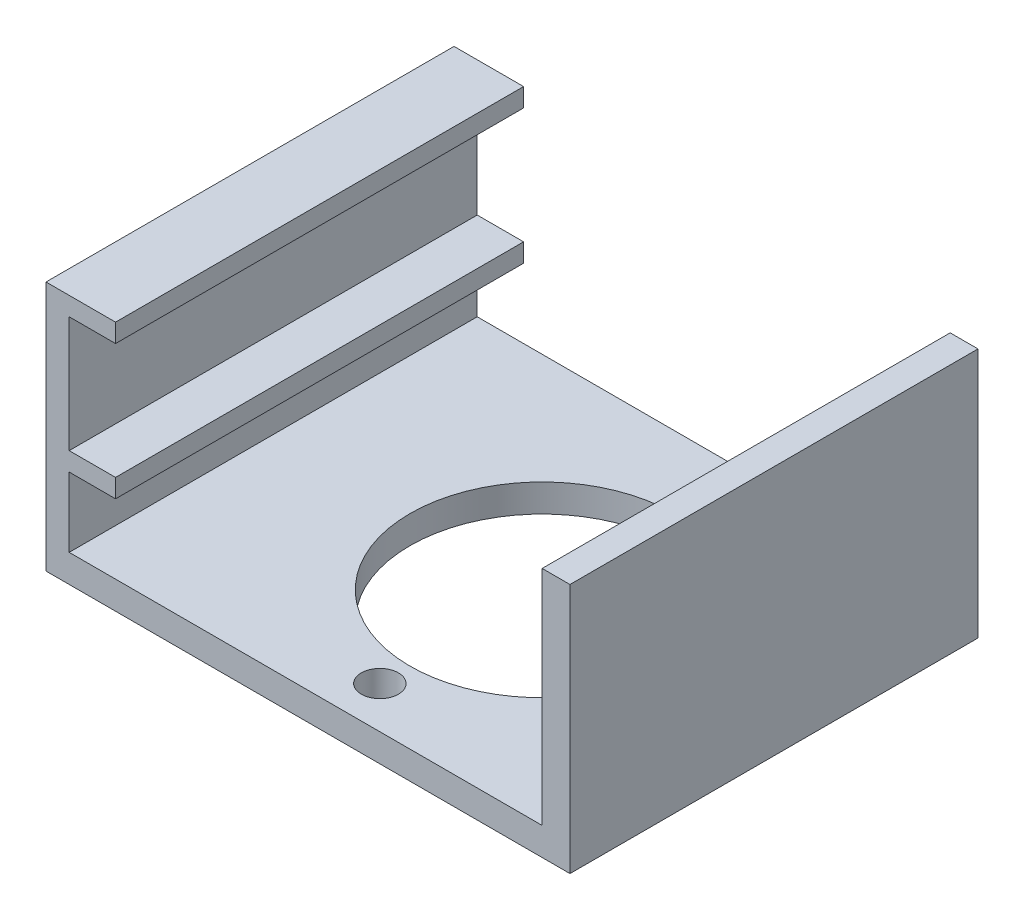
ISO-10303-21;
HEADER;
FILE_DESCRIPTION(('STEP AP214'),'2;1');
FILE_NAME('part.step','',(''),(''),'','','');
FILE_SCHEMA(('AUTOMOTIVE_DESIGN { 1 0 10303 214 1 1 1 1 }'));
ENDSEC;
DATA;
#1=APPLICATION_CONTEXT('core data for automotive mechanical design processes');
#2=APPLICATION_PROTOCOL_DEFINITION('international standard','automotive_design',2000,#1);
#3=PRODUCT_CONTEXT('',#1,'mechanical');
#4=PRODUCT('Part','Part','',(#3));
#5=PRODUCT_RELATED_PRODUCT_CATEGORY('part','',(#4));
#6=PRODUCT_DEFINITION_FORMATION('','',#4);
#7=PRODUCT_DEFINITION_CONTEXT('part definition',#1,'design');
#8=PRODUCT_DEFINITION('design','',#6,#7);
#9=PRODUCT_DEFINITION_SHAPE('','',#8);
#10=(LENGTH_UNIT() NAMED_UNIT(*) SI_UNIT(.MILLI.,.METRE.));
#11=(NAMED_UNIT(*) PLANE_ANGLE_UNIT() SI_UNIT($,.RADIAN.));
#12=(NAMED_UNIT(*) SI_UNIT($,.STERADIAN.) SOLID_ANGLE_UNIT());
#13=UNCERTAINTY_MEASURE_WITH_UNIT(LENGTH_MEASURE(1.E-05),#10,'distance_accuracy_value','');
#14=(GEOMETRIC_REPRESENTATION_CONTEXT(3) GLOBAL_UNCERTAINTY_ASSIGNED_CONTEXT((#13)) GLOBAL_UNIT_ASSIGNED_CONTEXT((#10,
#11,#12)) REPRESENTATION_CONTEXT('',''));
#15=CARTESIAN_POINT('',(0.,0.,0.));
#16=DIRECTION('',(0.,0.,1.));
#17=DIRECTION('',(1.,0.,0.));
#18=AXIS2_PLACEMENT_3D('',#15,#16,#17);
#19=CARTESIAN_POINT('',(0.,3.,0.));
#20=DIRECTION('',(0.,1.,0.));
#21=DIRECTION('',(0.,0.,1.));
#22=AXIS2_PLACEMENT_3D('',#19,#20,#21);
#23=PLANE('',#22);
#24=DIRECTION('',(-1.,0.,0.));
#25=VECTOR('',#24,1.);
#26=CARTESIAN_POINT('',(0.,3.,-4.18482749388201));
#27=LINE('',#26,#25);
#28=CARTESIAN_POINT('',(19.5682815384209,3.,-4.18482749388201));
#29=VERTEX_POINT('',#28);
#30=CARTESIAN_POINT('',(17.2661053468397,3.,-4.18482749388201));
#31=VERTEX_POINT('',#30);
#32=EDGE_CURVE('E261',#29,#31,#27,.T.);
#33=ORIENTED_EDGE('',*,*,#32,.F.);
#34=CARTESIAN_POINT('',(6.92093739266903,3.,5.61517250611799));
#35=DIRECTION('',(0.,1.,0.));
#36=DIRECTION('',(0.,0.,1.));
#37=AXIS2_PLACEMENT_3D('',#34,#35,#36);
#38=CIRCLE('',#37,15.9998535599887);
#39=CARTESIAN_POINT('',(21.1066807267733,3.,-1.78482749388201));
#40=VERTEX_POINT('',#39);
#41=EDGE_CURVE('E258',#40,#29,#38,.T.);
#42=ORIENTED_EDGE('',*,*,#41,.F.);
#43=DIRECTION('',(1.,0.,0.));
#44=VECTOR('',#43,1.);
#45=CARTESIAN_POINT('',(0.,3.,-1.78482749388201));
#46=LINE('',#45,#44);
#47=CARTESIAN_POINT('',(24.920937392669,3.,-1.78482749388201));
#48=VERTEX_POINT('',#47);
#49=EDGE_CURVE('E366',#40,#48,#46,.T.);
#50=ORIENTED_EDGE('',*,*,#49,.T.);
#51=DIRECTION('',(0.,0.,1.));
#52=VECTOR('',#51,1.);
#53=CARTESIAN_POINT('',(24.920937392669,3.,-16.384827493882));
#54=LINE('',#53,#52);
#55=CARTESIAN_POINT('',(24.920937392669,3.,13.015172506118));
#56=VERTEX_POINT('',#55);
#57=EDGE_CURVE('E293',#48,#56,#54,.T.);
#58=ORIENTED_EDGE('',*,*,#57,.T.);
#59=DIRECTION('',(1.,0.,0.));
#60=VECTOR('',#59,1.);
#61=CARTESIAN_POINT('',(0.,3.,13.015172506118));
#62=LINE('',#61,#60);
#63=CARTESIAN_POINT('',(21.1066807267733,3.,13.015172506118));
#64=VERTEX_POINT('',#63);
#65=EDGE_CURVE('E368',#64,#56,#62,.T.);
#66=ORIENTED_EDGE('',*,*,#65,.F.);
#67=CARTESIAN_POINT('',(6.92093739266903,3.,5.61517250611799));
#68=DIRECTION('',(0.,1.,0.));
#69=DIRECTION('',(0.,0.,1.));
#70=AXIS2_PLACEMENT_3D('',#67,#68,#69);
#71=CIRCLE('',#70,15.9998535599887);
#72=CARTESIAN_POINT('',(19.5682815384209,3.,15.415172506118));
#73=VERTEX_POINT('',#72);
#74=EDGE_CURVE('E271',#73,#64,#71,.T.);
#75=ORIENTED_EDGE('',*,*,#74,.F.);
#76=DIRECTION('',(-1.,0.,0.));
#77=VECTOR('',#76,1.);
#78=CARTESIAN_POINT('',(0.,3.,15.415172506118));
#79=LINE('',#78,#77);
#80=CARTESIAN_POINT('',(17.2661053468397,3.,15.415172506118));
#81=VERTEX_POINT('',#80);
#82=EDGE_CURVE('E257',#73,#81,#79,.T.);
#83=ORIENTED_EDGE('',*,*,#82,.T.);
#84=CARTESIAN_POINT('',(6.92093739266903,3.,5.61517250611799));
#85=DIRECTION('',(0.,1.,0.));
#86=DIRECTION('',(0.,0.,1.));
#87=AXIS2_PLACEMENT_3D('',#84,#85,#86);
#88=CIRCLE('',#87,14.25);
#89=EDGE_CURVE('E290',#31,#81,#88,.T.);
#90=ORIENTED_EDGE('',*,*,#89,.F.);
#91=EDGE_LOOP('',(#33,#42,#50,#58,#66,#75,#83,#90));
#92=FACE_BOUND('',#91,.T.);
#93=DIRECTION('',(-1.,0.,0.));
#94=VECTOR('',#93,1.);
#95=CARTESIAN_POINT('',(-19.079062607331,3.,27.615172506118));
#96=LINE('',#95,#94);
#97=CARTESIAN_POINT('',(28.920937392669,3.,27.615172506118));
#98=VERTEX_POINT('',#97);
#99=CARTESIAN_POINT('',(-22.079062607331,3.,27.615172506118));
#100=VERTEX_POINT('',#99);
#101=EDGE_CURVE('E346',#98,#100,#96,.T.);
#102=ORIENTED_EDGE('',*,*,#101,.F.);
#103=DIRECTION('',(0.,0.,1.));
#104=VECTOR('',#103,1.);
#105=CARTESIAN_POINT('',(28.920937392669,3.,-16.384827493882));
#106=LINE('',#105,#104);
#107=CARTESIAN_POINT('',(28.920937392669,3.,-16.384827493882));
#108=VERTEX_POINT('',#107);
#109=EDGE_CURVE('E297',#108,#98,#106,.T.);
#110=ORIENTED_EDGE('',*,*,#109,.F.);
#111=DIRECTION('',(1.,0.,0.));
#112=VECTOR('',#111,1.);
#113=CARTESIAN_POINT('',(24.920937392669,3.,-16.384827493882));
#114=LINE('',#113,#112);
#115=CARTESIAN_POINT('',(-22.079062607331,3.,-16.384827493882));
#116=VERTEX_POINT('',#115);
#117=EDGE_CURVE('E336',#116,#108,#114,.T.);
#118=ORIENTED_EDGE('',*,*,#117,.F.);
#119=DIRECTION('',(0.,0.,-1.));
#120=VECTOR('',#119,1.);
#121=CARTESIAN_POINT('',(-22.079062607331,3.,-16.384827493882));
#122=LINE('',#121,#120);
#123=EDGE_CURVE('E228',#100,#116,#122,.T.);
#124=ORIENTED_EDGE('',*,*,#123,.F.);
#125=EDGE_LOOP('',(#102,#110,#118,#124));
#126=FACE_BOUND('',#125,.T.);
#127=CARTESIAN_POINT('',(6.92093739266903,3.,23.115172506118));
#128=DIRECTION('',(0.,1.,0.));
#129=DIRECTION('',(0.,0.,1.));
#130=AXIS2_PLACEMENT_3D('',#127,#128,#129);
#131=CIRCLE('',#130,2.);
#132=CARTESIAN_POINT('',(6.92093739266903,3.,25.115172506118));
#133=VERTEX_POINT('',#132);
#134=EDGE_CURVE('E370',#133,#133,#131,.T.);
#135=ORIENTED_EDGE('',*,*,#134,.F.);
#136=EDGE_LOOP('',(#135));
#137=FACE_BOUND('',#136,.T.);
#138=CARTESIAN_POINT('',(6.92093739266903,3.,-11.884827493882));
#139=DIRECTION('',(0.,1.,0.));
#140=DIRECTION('',(0.,0.,1.));
#141=AXIS2_PLACEMENT_3D('',#138,#139,#140);
#142=CIRCLE('',#141,2.);
#143=CARTESIAN_POINT('',(6.92093739266903,3.,-9.88482749388201));
#144=VERTEX_POINT('',#143);
#145=EDGE_CURVE('E355',#144,#144,#142,.T.);
#146=ORIENTED_EDGE('',*,*,#145,.F.);
#147=EDGE_LOOP('',(#146));
#148=FACE_BOUND('',#147,.T.);
#149=ADVANCED_FACE('F36',(#92,#126,#137,#148),#23,.T.);
#150=CARTESIAN_POINT('',(0.,0.,0.));
#151=DIRECTION('',(0.,1.,0.));
#152=DIRECTION('',(0.,0.,1.));
#153=AXIS2_PLACEMENT_3D('',#150,#151,#152);
#154=PLANE('',#153);
#155=DIRECTION('',(1.,0.,0.));
#156=VECTOR('',#155,1.);
#157=CARTESIAN_POINT('',(26.920937392669,0.,27.615172506118));
#158=LINE('',#157,#156);
#159=CARTESIAN_POINT('',(-24.579062607331,0.,27.615172506118));
#160=VERTEX_POINT('',#159);
#161=CARTESIAN_POINT('',(31.920937392669,0.,27.615172506118));
#162=VERTEX_POINT('',#161);
#163=EDGE_CURVE('E205',#160,#162,#158,.T.);
#164=ORIENTED_EDGE('',*,*,#163,.F.);
#165=DIRECTION('',(0.,0.,1.));
#166=VECTOR('',#165,1.);
#167=CARTESIAN_POINT('',(-24.579062607331,0.,-16.384827493882));
#168=LINE('',#167,#166);
#169=CARTESIAN_POINT('',(-24.579062607331,0.,-16.384827493882));
#170=VERTEX_POINT('',#169);
#171=EDGE_CURVE('E203',#170,#160,#168,.T.);
#172=ORIENTED_EDGE('',*,*,#171,.F.);
#173=DIRECTION('',(-1.,0.,0.));
#174=VECTOR('',#173,1.);
#175=CARTESIAN_POINT('',(-23.079062607331,0.,-16.384827493882));
#176=LINE('',#175,#174);
#177=CARTESIAN_POINT('',(31.920937392669,0.,-16.384827493882));
#178=VERTEX_POINT('',#177);
#179=EDGE_CURVE('E187',#178,#170,#176,.T.);
#180=ORIENTED_EDGE('',*,*,#179,.F.);
#181=DIRECTION('',(0.,0.,-1.));
#182=VECTOR('',#181,1.);
#183=CARTESIAN_POINT('',(31.920937392669,0.,27.615172506118));
#184=LINE('',#183,#182);
#185=EDGE_CURVE('E309',#162,#178,#184,.T.);
#186=ORIENTED_EDGE('',*,*,#185,.F.);
#187=EDGE_LOOP('',(#164,#172,#180,#186));
#188=FACE_BOUND('',#187,.T.);
#189=CARTESIAN_POINT('',(6.92093739266903,0.,-11.884827493882));
#190=DIRECTION('',(0.,-1.,0.));
#191=DIRECTION('',(0.,0.,-1.));
#192=AXIS2_PLACEMENT_3D('',#189,#190,#191);
#193=CIRCLE('',#192,2.);
#194=CARTESIAN_POINT('',(6.92093739266903,0.,-13.884827493882));
#195=VERTEX_POINT('',#194);
#196=EDGE_CURVE('E351',#195,#195,#193,.T.);
#197=ORIENTED_EDGE('',*,*,#196,.F.);
#198=EDGE_LOOP('',(#197));
#199=FACE_BOUND('',#198,.T.);
#200=CARTESIAN_POINT('',(6.92093739266903,0.,23.115172506118));
#201=DIRECTION('',(0.,-1.,0.));
#202=DIRECTION('',(0.,0.,-1.));
#203=AXIS2_PLACEMENT_3D('',#200,#201,#202);
#204=CIRCLE('',#203,2.);
#205=CARTESIAN_POINT('',(6.92093739266903,0.,21.115172506118));
#206=VERTEX_POINT('',#205);
#207=EDGE_CURVE('E352',#206,#206,#204,.T.);
#208=ORIENTED_EDGE('',*,*,#207,.F.);
#209=EDGE_LOOP('',(#208));
#210=FACE_BOUND('',#209,.T.);
#211=CARTESIAN_POINT('',(6.92093739266903,0.,5.61517250611799));
#212=DIRECTION('',(0.,1.,0.));
#213=DIRECTION('',(0.,0.,1.));
#214=AXIS2_PLACEMENT_3D('',#211,#212,#213);
#215=CIRCLE('',#214,15.9998535599887);
#216=CARTESIAN_POINT('',(21.1066807267733,0.,-1.78482749388201));
#217=VERTEX_POINT('',#216);
#218=CARTESIAN_POINT('',(19.5682815384209,0.,-4.18482749388201));
#219=VERTEX_POINT('',#218);
#220=EDGE_CURVE('E281',#217,#219,#215,.T.);
#221=ORIENTED_EDGE('',*,*,#220,.T.);
#222=DIRECTION('',(-1.,0.,0.));
#223=VECTOR('',#222,1.);
#224=CARTESIAN_POINT('',(0.,0.,-4.18482749388201));
#225=LINE('',#224,#223);
#226=CARTESIAN_POINT('',(17.2661053468397,0.,-4.18482749388201));
#227=VERTEX_POINT('',#226);
#228=EDGE_CURVE('E278',#219,#227,#225,.T.);
#229=ORIENTED_EDGE('',*,*,#228,.T.);
#230=CARTESIAN_POINT('',(6.92093739266903,0.,5.61517250611799));
#231=DIRECTION('',(0.,-1.,0.));
#232=DIRECTION('',(0.,0.,-1.));
#233=AXIS2_PLACEMENT_3D('',#230,#231,#232);
#234=CIRCLE('',#233,14.25);
#235=CARTESIAN_POINT('',(17.2661053468397,0.,15.415172506118));
#236=VERTEX_POINT('',#235);
#237=EDGE_CURVE('E287',#236,#227,#234,.T.);
#238=ORIENTED_EDGE('',*,*,#237,.F.);
#239=DIRECTION('',(-1.,0.,0.));
#240=VECTOR('',#239,1.);
#241=CARTESIAN_POINT('',(0.,0.,15.415172506118));
#242=LINE('',#241,#240);
#243=CARTESIAN_POINT('',(19.5682815384209,0.,15.415172506118));
#244=VERTEX_POINT('',#243);
#245=EDGE_CURVE('E267',#244,#236,#242,.T.);
#246=ORIENTED_EDGE('',*,*,#245,.F.);
#247=CARTESIAN_POINT('',(6.92093739266903,0.,5.61517250611799));
#248=DIRECTION('',(0.,1.,0.));
#249=DIRECTION('',(0.,0.,1.));
#250=AXIS2_PLACEMENT_3D('',#247,#248,#249);
#251=CIRCLE('',#250,15.9998535599887);
#252=CARTESIAN_POINT('',(21.1066807267733,0.,13.015172506118));
#253=VERTEX_POINT('',#252);
#254=EDGE_CURVE('E284',#244,#253,#251,.T.);
#255=ORIENTED_EDGE('',*,*,#254,.T.);
#256=DIRECTION('',(-1.,0.,0.));
#257=VECTOR('',#256,1.);
#258=CARTESIAN_POINT('',(0.,0.,13.015172506118));
#259=LINE('',#258,#257);
#260=CARTESIAN_POINT('',(24.920937392669,0.,13.015172506118));
#261=VERTEX_POINT('',#260);
#262=EDGE_CURVE('E357',#261,#253,#259,.T.);
#263=ORIENTED_EDGE('',*,*,#262,.F.);
#264=DIRECTION('',(0.,0.,1.));
#265=VECTOR('',#264,1.);
#266=CARTESIAN_POINT('',(24.920937392669,0.,13.015172506118));
#267=LINE('',#266,#265);
#268=CARTESIAN_POINT('',(24.920937392669,0.,-1.78482749388201));
#269=VERTEX_POINT('',#268);
#270=EDGE_CURVE('E321',#269,#261,#267,.T.);
#271=ORIENTED_EDGE('',*,*,#270,.F.);
#272=DIRECTION('',(-1.,0.,0.));
#273=VECTOR('',#272,1.);
#274=CARTESIAN_POINT('',(0.,0.,-1.78482749388201));
#275=LINE('',#274,#273);
#276=EDGE_CURVE('E356',#269,#217,#275,.T.);
#277=ORIENTED_EDGE('',*,*,#276,.T.);
#278=EDGE_LOOP('',(#221,#229,#238,#246,#255,#263,#271,#277));
#279=FACE_BOUND('',#278,.T.);
#280=ADVANCED_FACE('F38',(#188,#199,#210,#279),#154,.F.);
#281=CARTESIAN_POINT('',(6.92093739266903,4.,5.61517250611799));
#282=DIRECTION('',(0.,-1.,0.));
#283=DIRECTION('',(0.,0.,-1.));
#284=AXIS2_PLACEMENT_3D('',#281,#282,#283);
#285=CYLINDRICAL_SURFACE('',#284,14.25);
#286=ORIENTED_EDGE('',*,*,#237,.T.);
#287=DIRECTION('',(0.,-1.,0.));
#288=VECTOR('',#287,1.);
#289=CARTESIAN_POINT('',(17.2661053468397,4.,-4.18482749388201));
#290=LINE('',#289,#288);
#291=EDGE_CURVE('E12',#227,#31,#290,.F.);
#292=ORIENTED_EDGE('',*,*,#291,.T.);
#293=ORIENTED_EDGE('',*,*,#89,.T.);
#294=DIRECTION('',(0.,-1.,0.));
#295=VECTOR('',#294,1.);
#296=CARTESIAN_POINT('',(17.2661053468397,4.,15.415172506118));
#297=LINE('',#296,#295);
#298=EDGE_CURVE('E46',#236,#81,#297,.F.);
#299=ORIENTED_EDGE('',*,*,#298,.F.);
#300=EDGE_LOOP('',(#286,#292,#293,#299));
#301=FACE_BOUND('',#300,.T.);
#302=ADVANCED_FACE('F387',(#301),#285,.F.);
#303=CARTESIAN_POINT('',(0.,27.,0.));
#304=DIRECTION('',(0.,1.,0.));
#305=DIRECTION('',(0.,0.,1.));
#306=AXIS2_PLACEMENT_3D('',#303,#304,#305);
#307=PLANE('',#306);
#308=DIRECTION('',(0.,0.,1.));
#309=VECTOR('',#308,1.);
#310=CARTESIAN_POINT('',(-17.079062607331,27.,-16.384827493882));
#311=LINE('',#310,#309);
#312=CARTESIAN_POINT('',(-17.079062607331,27.,-16.384827493882));
#313=VERTEX_POINT('',#312);
#314=CARTESIAN_POINT('',(-17.079062607331,27.,27.615172506118));
#315=VERTEX_POINT('',#314);
#316=EDGE_CURVE('E240',#313,#315,#311,.T.);
#317=ORIENTED_EDGE('',*,*,#316,.F.);
#318=DIRECTION('',(1.,0.,0.));
#319=VECTOR('',#318,1.);
#320=CARTESIAN_POINT('',(-19.079062607331,27.,-16.384827493882));
#321=LINE('',#320,#319);
#322=CARTESIAN_POINT('',(-24.579062607331,27.,-16.384827493882));
#323=VERTEX_POINT('',#322);
#324=EDGE_CURVE('E199',#323,#313,#321,.T.);
#325=ORIENTED_EDGE('',*,*,#324,.F.);
#326=DIRECTION('',(0.,0.,-1.));
#327=VECTOR('',#326,1.);
#328=CARTESIAN_POINT('',(-24.579062607331,27.,-16.384827493882));
#329=LINE('',#328,#327);
#330=CARTESIAN_POINT('',(-24.579062607331,27.,27.615172506118));
#331=VERTEX_POINT('',#330);
#332=EDGE_CURVE('E214',#331,#323,#329,.T.);
#333=ORIENTED_EDGE('',*,*,#332,.F.);
#334=DIRECTION('',(-1.,0.,0.));
#335=VECTOR('',#334,1.);
#336=CARTESIAN_POINT('',(-23.079062607331,27.,27.615172506118));
#337=LINE('',#336,#335);
#338=EDGE_CURVE('E340',#315,#331,#337,.T.);
#339=ORIENTED_EDGE('',*,*,#338,.F.);
#340=EDGE_LOOP('',(#317,#325,#333,#339));
#341=FACE_BOUND('',#340,.T.);
#342=ADVANCED_FACE('F426',(#341),#307,.T.);
#343=CARTESIAN_POINT('',(-21.079062607331,25.,25.615172506118));
#344=DIRECTION('',(0.,1.,0.));
#345=DIRECTION('',(0.,0.,1.));
#346=AXIS2_PLACEMENT_3D('',#343,#344,#345);
#347=PLANE('',#346);
#348=DIRECTION('',(-1.,0.,0.));
#349=VECTOR('',#348,1.);
#350=CARTESIAN_POINT('',(-21.079062607331,25.,-16.384827493882));
#351=LINE('',#350,#349);
#352=CARTESIAN_POINT('',(-17.079062607331,25.,-16.384827493882));
#353=VERTEX_POINT('',#352);
#354=CARTESIAN_POINT('',(-22.079062607331,25.,-16.384827493882));
#355=VERTEX_POINT('',#354);
#356=EDGE_CURVE('E334',#353,#355,#351,.T.);
#357=ORIENTED_EDGE('',*,*,#356,.F.);
#358=DIRECTION('',(0.,0.,-1.));
#359=VECTOR('',#358,1.);
#360=CARTESIAN_POINT('',(-17.079062607331,25.,-16.384827493882));
#361=LINE('',#360,#359);
#362=CARTESIAN_POINT('',(-17.079062607331,25.,27.615172506118));
#363=VERTEX_POINT('',#362);
#364=EDGE_CURVE('E61',#363,#353,#361,.T.);
#365=ORIENTED_EDGE('',*,*,#364,.F.);
#366=DIRECTION('',(1.,0.,0.));
#367=VECTOR('',#366,1.);
#368=CARTESIAN_POINT('',(-19.079062607331,25.,27.615172506118));
#369=LINE('',#368,#367);
#370=CARTESIAN_POINT('',(-22.079062607331,25.,27.615172506118));
#371=VERTEX_POINT('',#370);
#372=EDGE_CURVE('E348',#371,#363,#369,.T.);
#373=ORIENTED_EDGE('',*,*,#372,.F.);
#374=DIRECTION('',(0.,0.,1.));
#375=VECTOR('',#374,1.);
#376=CARTESIAN_POINT('',(-22.079062607331,25.,-16.384827493882));
#377=LINE('',#376,#375);
#378=EDGE_CURVE('E248',#355,#371,#377,.T.);
#379=ORIENTED_EDGE('',*,*,#378,.F.);
#380=EDGE_LOOP('',(#357,#365,#373,#379));
#381=FACE_BOUND('',#380,.T.);
#382=ADVANCED_FACE('F429',(#381),#347,.F.);
#383=CARTESIAN_POINT('',(24.920937392669,27.,-14.384827493882));
#384=DIRECTION('',(1.,0.,0.));
#385=DIRECTION('',(0.,0.,-1.));
#386=AXIS2_PLACEMENT_3D('',#383,#384,#385);
#387=PLANE('',#386);
#388=DIRECTION('',(0.,1.,0.));
#389=VECTOR('',#388,1.);
#390=CARTESIAN_POINT('',(24.920937392669,0.,13.015172506118));
#391=LINE('',#390,#389);
#392=EDGE_CURVE('E315',#261,#56,#391,.T.);
#393=ORIENTED_EDGE('',*,*,#392,.T.);
#394=ORIENTED_EDGE('',*,*,#57,.F.);
#395=DIRECTION('',(0.,-1.,0.));
#396=VECTOR('',#395,1.);
#397=CARTESIAN_POINT('',(24.920937392669,0.,-1.78482749388201));
#398=LINE('',#397,#396);
#399=EDGE_CURVE('E318',#48,#269,#398,.T.);
#400=ORIENTED_EDGE('',*,*,#399,.T.);
#401=ORIENTED_EDGE('',*,*,#270,.T.);
#402=EDGE_LOOP('',(#393,#394,#400,#401));
#403=FACE_BOUND('',#402,.T.);
#404=ADVANCED_FACE('F403',(#403),#387,.F.);
#405=CARTESIAN_POINT('',(0.,27.,0.));
#406=DIRECTION('',(0.,1.,0.));
#407=DIRECTION('',(0.,0.,1.));
#408=AXIS2_PLACEMENT_3D('',#405,#406,#407);
#409=PLANE('',#408);
#410=DIRECTION('',(0.,0.,-1.));
#411=VECTOR('',#410,1.);
#412=CARTESIAN_POINT('',(28.920937392669,27.,-16.384827493882));
#413=LINE('',#412,#411);
#414=CARTESIAN_POINT('',(28.920937392669,27.,27.615172506118));
#415=VERTEX_POINT('',#414);
#416=CARTESIAN_POINT('',(28.920937392669,27.,-16.384827493882));
#417=VERTEX_POINT('',#416);
#418=EDGE_CURVE('E302',#415,#417,#413,.T.);
#419=ORIENTED_EDGE('',*,*,#418,.F.);
#420=DIRECTION('',(-1.,0.,0.));
#421=VECTOR('',#420,1.);
#422=CARTESIAN_POINT('',(24.920937392669,27.,27.615172506118));
#423=LINE('',#422,#421);
#424=CARTESIAN_POINT('',(31.920937392669,27.,27.615172506118));
#425=VERTEX_POINT('',#424);
#426=EDGE_CURVE('E343',#425,#415,#423,.T.);
#427=ORIENTED_EDGE('',*,*,#426,.F.);
#428=DIRECTION('',(0.,0.,1.));
#429=VECTOR('',#428,1.);
#430=CARTESIAN_POINT('',(31.920937392669,27.,27.615172506118));
#431=LINE('',#430,#429);
#432=CARTESIAN_POINT('',(31.920937392669,27.,-16.384827493882));
#433=VERTEX_POINT('',#432);
#434=EDGE_CURVE('E312',#433,#425,#431,.T.);
#435=ORIENTED_EDGE('',*,*,#434,.F.);
#436=DIRECTION('',(1.,0.,0.));
#437=VECTOR('',#436,1.);
#438=CARTESIAN_POINT('',(26.920937392669,27.,-16.384827493882));
#439=LINE('',#438,#437);
#440=EDGE_CURVE('E338',#417,#433,#439,.T.);
#441=ORIENTED_EDGE('',*,*,#440,.F.);
#442=EDGE_LOOP('',(#419,#427,#435,#441));
#443=FACE_BOUND('',#442,.T.);
#444=ADVANCED_FACE('F436',(#443),#409,.T.);
#445=CARTESIAN_POINT('',(6.92093739266903,5.,-11.884827493882));
#446=DIRECTION('',(0.,-1.,0.));
#447=DIRECTION('',(0.,0.,-1.));
#448=AXIS2_PLACEMENT_3D('',#445,#446,#447);
#449=CYLINDRICAL_SURFACE('',#448,2.);
#450=ORIENTED_EDGE('',*,*,#145,.T.);
#451=EDGE_LOOP('',(#450));
#452=FACE_BOUND('',#451,.T.);
#453=ORIENTED_EDGE('',*,*,#196,.T.);
#454=EDGE_LOOP('',(#453));
#455=FACE_BOUND('',#454,.T.);
#456=ADVANCED_FACE('F439',(#452,#455),#449,.F.);
#457=CARTESIAN_POINT('',(0.,5.,13.015172506118));
#458=DIRECTION('',(0.,0.,1.));
#459=DIRECTION('',(1.,0.,0.));
#460=AXIS2_PLACEMENT_3D('',#457,#458,#459);
#461=PLANE('',#460);
#462=ORIENTED_EDGE('',*,*,#262,.T.);
#463=DIRECTION('',(0.,1.,0.));
#464=VECTOR('',#463,1.);
#465=CARTESIAN_POINT('',(21.1066807267733,-1.,13.015172506118));
#466=LINE('',#465,#464);
#467=EDGE_CURVE('E262',#253,#64,#466,.T.);
#468=ORIENTED_EDGE('',*,*,#467,.T.);
#469=ORIENTED_EDGE('',*,*,#65,.T.);
#470=ORIENTED_EDGE('',*,*,#392,.F.);
#471=EDGE_LOOP('',(#462,#468,#469,#470));
#472=FACE_BOUND('',#471,.T.);
#473=ADVANCED_FACE('F406',(#472),#461,.F.);
#474=CARTESIAN_POINT('',(0.,5.,-1.78482749388201));
#475=DIRECTION('',(0.,0.,1.));
#476=DIRECTION('',(1.,0.,0.));
#477=AXIS2_PLACEMENT_3D('',#474,#475,#476);
#478=PLANE('',#477);
#479=DIRECTION('',(0.,1.,0.));
#480=VECTOR('',#479,1.);
#481=CARTESIAN_POINT('',(21.1066807267733,-1.,-1.78482749388201));
#482=LINE('',#481,#480);
#483=EDGE_CURVE('E264',#217,#40,#482,.T.);
#484=ORIENTED_EDGE('',*,*,#483,.F.);
#485=ORIENTED_EDGE('',*,*,#276,.F.);
#486=ORIENTED_EDGE('',*,*,#399,.F.);
#487=ORIENTED_EDGE('',*,*,#49,.F.);
#488=EDGE_LOOP('',(#484,#485,#486,#487));
#489=FACE_BOUND('',#488,.T.);
#490=ADVANCED_FACE('F399',(#489),#478,.T.);
#491=CARTESIAN_POINT('',(6.92093739266903,5.,23.115172506118));
#492=DIRECTION('',(0.,-1.,0.));
#493=DIRECTION('',(0.,0.,-1.));
#494=AXIS2_PLACEMENT_3D('',#491,#492,#493);
#495=CYLINDRICAL_SURFACE('',#494,2.);
#496=ORIENTED_EDGE('',*,*,#134,.T.);
#497=EDGE_LOOP('',(#496));
#498=FACE_BOUND('',#497,.T.);
#499=ORIENTED_EDGE('',*,*,#207,.T.);
#500=EDGE_LOOP('',(#499));
#501=FACE_BOUND('',#500,.T.);
#502=ADVANCED_FACE('F448',(#498,#501),#495,.F.);
#503=CARTESIAN_POINT('',(0.,0.,27.615172506118));
#504=DIRECTION('',(0.,0.,-1.));
#505=DIRECTION('',(-1.,0.,0.));
#506=AXIS2_PLACEMENT_3D('',#503,#504,#505);
#507=PLANE('',#506);
#508=ORIENTED_EDGE('',*,*,#101,.T.);
#509=DIRECTION('',(0.,-1.,0.));
#510=VECTOR('',#509,1.);
#511=CARTESIAN_POINT('',(-22.079062607331,3.,27.615172506118));
#512=LINE('',#511,#510);
#513=CARTESIAN_POINT('',(-22.079062607331,10.5,27.615172506118));
#514=VERTEX_POINT('',#513);
#515=EDGE_CURVE('E225',#514,#100,#512,.T.);
#516=ORIENTED_EDGE('',*,*,#515,.F.);
#517=DIRECTION('',(-1.,0.,0.));
#518=VECTOR('',#517,1.);
#519=CARTESIAN_POINT('',(-16.079062607331,10.5,27.615172506118));
#520=LINE('',#519,#518);
#521=CARTESIAN_POINT('',(-17.079062607331,10.5,27.615172506118));
#522=VERTEX_POINT('',#521);
#523=EDGE_CURVE('E324',#522,#514,#520,.T.);
#524=ORIENTED_EDGE('',*,*,#523,.F.);
#525=DIRECTION('',(0.,-1.,0.));
#526=VECTOR('',#525,1.);
#527=CARTESIAN_POINT('',(-17.079062607331,10.5,27.615172506118));
#528=LINE('',#527,#526);
#529=CARTESIAN_POINT('',(-17.079062607331,12.5,27.615172506118));
#530=VERTEX_POINT('',#529);
#531=EDGE_CURVE('E53',#530,#522,#528,.T.);
#532=ORIENTED_EDGE('',*,*,#531,.F.);
#533=DIRECTION('',(-1.,0.,0.));
#534=VECTOR('',#533,1.);
#535=CARTESIAN_POINT('',(-21.079062607331,12.5,27.615172506118));
#536=LINE('',#535,#534);
#537=CARTESIAN_POINT('',(-22.079062607331,12.5,27.615172506118));
#538=VERTEX_POINT('',#537);
#539=EDGE_CURVE('E40',#530,#538,#536,.T.);
#540=ORIENTED_EDGE('',*,*,#539,.T.);
#541=DIRECTION('',(0.,-1.,0.));
#542=VECTOR('',#541,1.);
#543=CARTESIAN_POINT('',(-22.079062607331,12.5,27.615172506118));
#544=LINE('',#543,#542);
#545=EDGE_CURVE('E251',#371,#538,#544,.T.);
#546=ORIENTED_EDGE('',*,*,#545,.F.);
#547=ORIENTED_EDGE('',*,*,#372,.T.);
#548=DIRECTION('',(0.,-1.,0.));
#549=VECTOR('',#548,1.);
#550=CARTESIAN_POINT('',(-17.079062607331,27.,27.615172506118));
#551=LINE('',#550,#549);
#552=EDGE_CURVE('E242',#315,#363,#551,.T.);
#553=ORIENTED_EDGE('',*,*,#552,.F.);
#554=ORIENTED_EDGE('',*,*,#338,.T.);
#555=DIRECTION('',(0.,1.,0.));
#556=VECTOR('',#555,1.);
#557=CARTESIAN_POINT('',(-24.579062607331,27.,27.615172506118));
#558=LINE('',#557,#556);
#559=EDGE_CURVE('E209',#160,#331,#558,.T.);
#560=ORIENTED_EDGE('',*,*,#559,.F.);
#561=ORIENTED_EDGE('',*,*,#163,.T.);
#562=DIRECTION('',(0.,-1.,0.));
#563=VECTOR('',#562,1.);
#564=CARTESIAN_POINT('',(31.920937392669,27.,27.615172506118));
#565=LINE('',#564,#563);
#566=EDGE_CURVE('E304',#425,#162,#565,.T.);
#567=ORIENTED_EDGE('',*,*,#566,.F.);
#568=ORIENTED_EDGE('',*,*,#426,.T.);
#569=DIRECTION('',(0.,1.,0.));
#570=VECTOR('',#569,1.);
#571=CARTESIAN_POINT('',(28.920937392669,3.,27.615172506118));
#572=LINE('',#571,#570);
#573=EDGE_CURVE('E300',#98,#415,#572,.T.);
#574=ORIENTED_EDGE('',*,*,#573,.F.);
#575=EDGE_LOOP('',(#508,#516,#524,#532,#540,#546,#547,#553,#554,#560,#561,#567,#568,#574));
#576=FACE_BOUND('',#575,.T.);
#577=ADVANCED_FACE('F451',(#576),#507,.F.);
#578=CARTESIAN_POINT('',(0.,0.,-16.384827493882));
#579=DIRECTION('',(0.,0.,1.));
#580=DIRECTION('',(1.,0.,0.));
#581=AXIS2_PLACEMENT_3D('',#578,#579,#580);
#582=PLANE('',#581);
#583=DIRECTION('',(0.,1.,0.));
#584=VECTOR('',#583,1.);
#585=CARTESIAN_POINT('',(-22.079062607331,3.,-16.384827493882));
#586=LINE('',#585,#584);
#587=CARTESIAN_POINT('',(-22.079062607331,10.5,-16.384827493882));
#588=VERTEX_POINT('',#587);
#589=EDGE_CURVE('E219',#116,#588,#586,.T.);
#590=ORIENTED_EDGE('',*,*,#589,.F.);
#591=ORIENTED_EDGE('',*,*,#117,.T.);
#592=DIRECTION('',(0.,-1.,0.));
#593=VECTOR('',#592,1.);
#594=CARTESIAN_POINT('',(28.920937392669,3.,-16.384827493882));
#595=LINE('',#594,#593);
#596=EDGE_CURVE('E294',#417,#108,#595,.T.);
#597=ORIENTED_EDGE('',*,*,#596,.F.);
#598=ORIENTED_EDGE('',*,*,#440,.T.);
#599=DIRECTION('',(0.,1.,0.));
#600=VECTOR('',#599,1.);
#601=CARTESIAN_POINT('',(31.920937392669,27.,-16.384827493882));
#602=LINE('',#601,#600);
#603=EDGE_CURVE('E195',#178,#433,#602,.T.);
#604=ORIENTED_EDGE('',*,*,#603,.F.);
#605=ORIENTED_EDGE('',*,*,#179,.T.);
#606=DIRECTION('',(0.,-1.,0.));
#607=VECTOR('',#606,1.);
#608=CARTESIAN_POINT('',(-24.579062607331,27.,-16.384827493882));
#609=LINE('',#608,#607);
#610=EDGE_CURVE('E193',#323,#170,#609,.T.);
#611=ORIENTED_EDGE('',*,*,#610,.F.);
#612=ORIENTED_EDGE('',*,*,#324,.T.);
#613=DIRECTION('',(0.,1.,0.));
#614=VECTOR('',#613,1.);
#615=CARTESIAN_POINT('',(-17.079062607331,27.,-16.384827493882));
#616=LINE('',#615,#614);
#617=EDGE_CURVE('E238',#353,#313,#616,.T.);
#618=ORIENTED_EDGE('',*,*,#617,.F.);
#619=ORIENTED_EDGE('',*,*,#356,.T.);
#620=DIRECTION('',(0.,1.,0.));
#621=VECTOR('',#620,1.);
#622=CARTESIAN_POINT('',(-22.079062607331,12.5,-16.384827493882));
#623=LINE('',#622,#621);
#624=CARTESIAN_POINT('',(-22.079062607331,12.5,-16.384827493882));
#625=VERTEX_POINT('',#624);
#626=EDGE_CURVE('E245',#625,#355,#623,.T.);
#627=ORIENTED_EDGE('',*,*,#626,.F.);
#628=DIRECTION('',(1.,0.,0.));
#629=VECTOR('',#628,1.);
#630=CARTESIAN_POINT('',(-21.079062607331,12.5,-16.384827493882));
#631=LINE('',#630,#629);
#632=CARTESIAN_POINT('',(-17.079062607331,12.5,-16.384827493882));
#633=VERTEX_POINT('',#632);
#634=EDGE_CURVE('E200',#625,#633,#631,.T.);
#635=ORIENTED_EDGE('',*,*,#634,.T.);
#636=DIRECTION('',(0.,1.,0.));
#637=VECTOR('',#636,1.);
#638=CARTESIAN_POINT('',(-17.079062607331,10.5,-16.384827493882));
#639=LINE('',#638,#637);
#640=CARTESIAN_POINT('',(-17.079062607331,10.5,-16.384827493882));
#641=VERTEX_POINT('',#640);
#642=EDGE_CURVE('E234',#641,#633,#639,.T.);
#643=ORIENTED_EDGE('',*,*,#642,.F.);
#644=DIRECTION('',(-1.,0.,0.));
#645=VECTOR('',#644,1.);
#646=CARTESIAN_POINT('',(-16.079062607331,10.5,-16.384827493882));
#647=LINE('',#646,#645);
#648=EDGE_CURVE('E326',#641,#588,#647,.T.);
#649=ORIENTED_EDGE('',*,*,#648,.T.);
#650=EDGE_LOOP('',(#590,#591,#597,#598,#604,#605,#611,#612,#618,#619,#627,#635,#643,#649));
#651=FACE_BOUND('',#650,.T.);
#652=ADVANCED_FACE('F190',(#651),#582,.F.);
#653=CARTESIAN_POINT('',(0.,12.5,0.));
#654=DIRECTION('',(0.,1.,0.));
#655=DIRECTION('',(0.,0.,1.));
#656=AXIS2_PLACEMENT_3D('',#653,#654,#655);
#657=PLANE('',#656);
#658=DIRECTION('',(0.,0.,1.));
#659=VECTOR('',#658,1.);
#660=CARTESIAN_POINT('',(-17.079062607331,12.5,27.615172506118));
#661=LINE('',#660,#659);
#662=EDGE_CURVE('E236',#633,#530,#661,.T.);
#663=ORIENTED_EDGE('',*,*,#662,.F.);
#664=ORIENTED_EDGE('',*,*,#634,.F.);
#665=DIRECTION('',(0.,0.,-1.));
#666=VECTOR('',#665,1.);
#667=CARTESIAN_POINT('',(-22.079062607331,12.5,-16.384827493882));
#668=LINE('',#667,#666);
#669=EDGE_CURVE('E254',#538,#625,#668,.T.);
#670=ORIENTED_EDGE('',*,*,#669,.F.);
#671=ORIENTED_EDGE('',*,*,#539,.F.);
#672=EDGE_LOOP('',(#663,#664,#670,#671));
#673=FACE_BOUND('',#672,.T.);
#674=ADVANCED_FACE('F458',(#673),#657,.T.);
#675=CARTESIAN_POINT('',(-16.079062607331,10.5,27.615172506118));
#676=DIRECTION('',(0.,1.,0.));
#677=DIRECTION('',(0.,0.,1.));
#678=AXIS2_PLACEMENT_3D('',#675,#676,#677);
#679=PLANE('',#678);
#680=ORIENTED_EDGE('',*,*,#648,.F.);
#681=DIRECTION('',(0.,0.,-1.));
#682=VECTOR('',#681,1.);
#683=CARTESIAN_POINT('',(-17.079062607331,10.5,27.615172506118));
#684=LINE('',#683,#682);
#685=EDGE_CURVE('E232',#522,#641,#684,.T.);
#686=ORIENTED_EDGE('',*,*,#685,.F.);
#687=ORIENTED_EDGE('',*,*,#523,.T.);
#688=DIRECTION('',(0.,0.,1.));
#689=VECTOR('',#688,1.);
#690=CARTESIAN_POINT('',(-22.079062607331,10.5,-16.384827493882));
#691=LINE('',#690,#689);
#692=EDGE_CURVE('E222',#588,#514,#691,.T.);
#693=ORIENTED_EDGE('',*,*,#692,.F.);
#694=EDGE_LOOP('',(#680,#686,#687,#693));
#695=FACE_BOUND('',#694,.T.);
#696=ADVANCED_FACE('F461',(#695),#679,.F.);
#697=CARTESIAN_POINT('',(31.920937392669,0.,0.));
#698=DIRECTION('',(1.,0.,0.));
#699=DIRECTION('',(0.,0.,-1.));
#700=AXIS2_PLACEMENT_3D('',#697,#698,#699);
#701=PLANE('',#700);
#702=ORIENTED_EDGE('',*,*,#566,.T.);
#703=ORIENTED_EDGE('',*,*,#185,.T.);
#704=ORIENTED_EDGE('',*,*,#603,.T.);
#705=ORIENTED_EDGE('',*,*,#434,.T.);
#706=EDGE_LOOP('',(#702,#703,#704,#705));
#707=FACE_BOUND('',#706,.T.);
#708=ADVANCED_FACE('F417',(#707),#701,.T.);
#709=CARTESIAN_POINT('',(28.920937392669,0.,0.));
#710=DIRECTION('',(1.,0.,0.));
#711=DIRECTION('',(0.,0.,-1.));
#712=AXIS2_PLACEMENT_3D('',#709,#710,#711);
#713=PLANE('',#712);
#714=ORIENTED_EDGE('',*,*,#596,.T.);
#715=ORIENTED_EDGE('',*,*,#109,.T.);
#716=ORIENTED_EDGE('',*,*,#573,.T.);
#717=ORIENTED_EDGE('',*,*,#418,.T.);
#718=EDGE_LOOP('',(#714,#715,#716,#717));
#719=FACE_BOUND('',#718,.T.);
#720=ADVANCED_FACE('F410',(#719),#713,.F.);
#721=CARTESIAN_POINT('',(6.92093739266903,-1.,5.61517250611799));
#722=DIRECTION('',(0.,1.,0.));
#723=DIRECTION('',(0.,0.,1.));
#724=AXIS2_PLACEMENT_3D('',#721,#722,#723);
#725=CYLINDRICAL_SURFACE('',#724,15.9998535599887);
#726=DIRECTION('',(0.,1.,0.));
#727=VECTOR('',#726,1.);
#728=CARTESIAN_POINT('',(19.5682815384209,-1.,15.415172506118));
#729=LINE('',#728,#727);
#730=EDGE_CURVE('E273',#244,#73,#729,.T.);
#731=ORIENTED_EDGE('',*,*,#730,.T.);
#732=ORIENTED_EDGE('',*,*,#74,.T.);
#733=ORIENTED_EDGE('',*,*,#467,.F.);
#734=ORIENTED_EDGE('',*,*,#254,.F.);
#735=EDGE_LOOP('',(#731,#732,#733,#734));
#736=FACE_BOUND('',#735,.T.);
#737=ADVANCED_FACE('F408',(#736),#725,.F.);
#738=CARTESIAN_POINT('',(0.,-1.,15.415172506118));
#739=DIRECTION('',(0.,0.,-1.));
#740=DIRECTION('',(-1.,0.,0.));
#741=AXIS2_PLACEMENT_3D('',#738,#739,#740);
#742=PLANE('',#741);
#743=ORIENTED_EDGE('',*,*,#245,.T.);
#744=ORIENTED_EDGE('',*,*,#298,.T.);
#745=ORIENTED_EDGE('',*,*,#82,.F.);
#746=ORIENTED_EDGE('',*,*,#730,.F.);
#747=EDGE_LOOP('',(#743,#744,#745,#746));
#748=FACE_BOUND('',#747,.T.);
#749=ADVANCED_FACE('F376',(#748),#742,.T.);
#750=CARTESIAN_POINT('',(6.92093739266903,-1.,5.61517250611799));
#751=DIRECTION('',(0.,1.,0.));
#752=DIRECTION('',(0.,0.,1.));
#753=AXIS2_PLACEMENT_3D('',#750,#751,#752);
#754=CYLINDRICAL_SURFACE('',#753,15.9998535599887);
#755=ORIENTED_EDGE('',*,*,#483,.T.);
#756=ORIENTED_EDGE('',*,*,#41,.T.);
#757=DIRECTION('',(0.,1.,0.));
#758=VECTOR('',#757,1.);
#759=CARTESIAN_POINT('',(19.5682815384209,-1.,-4.18482749388201));
#760=LINE('',#759,#758);
#761=EDGE_CURVE('E265',#219,#29,#760,.T.);
#762=ORIENTED_EDGE('',*,*,#761,.F.);
#763=ORIENTED_EDGE('',*,*,#220,.F.);
#764=EDGE_LOOP('',(#755,#756,#762,#763));
#765=FACE_BOUND('',#764,.T.);
#766=ADVANCED_FACE('F395',(#765),#754,.F.);
#767=CARTESIAN_POINT('',(0.,-1.,-4.18482749388201));
#768=DIRECTION('',(0.,0.,-1.));
#769=DIRECTION('',(-1.,0.,0.));
#770=AXIS2_PLACEMENT_3D('',#767,#768,#769);
#771=PLANE('',#770);
#772=ORIENTED_EDGE('',*,*,#761,.T.);
#773=ORIENTED_EDGE('',*,*,#32,.T.);
#774=ORIENTED_EDGE('',*,*,#291,.F.);
#775=ORIENTED_EDGE('',*,*,#228,.F.);
#776=EDGE_LOOP('',(#772,#773,#774,#775));
#777=FACE_BOUND('',#776,.T.);
#778=ADVANCED_FACE('F389',(#777),#771,.F.);
#779=CARTESIAN_POINT('',(-22.079062607331,0.,0.));
#780=DIRECTION('',(1.,0.,0.));
#781=DIRECTION('',(0.,0.,-1.));
#782=AXIS2_PLACEMENT_3D('',#779,#780,#781);
#783=PLANE('',#782);
#784=ORIENTED_EDGE('',*,*,#626,.T.);
#785=ORIENTED_EDGE('',*,*,#378,.T.);
#786=ORIENTED_EDGE('',*,*,#545,.T.);
#787=ORIENTED_EDGE('',*,*,#669,.T.);
#788=EDGE_LOOP('',(#784,#785,#786,#787));
#789=FACE_BOUND('',#788,.T.);
#790=ADVANCED_FACE('F600',(#789),#783,.T.);
#791=CARTESIAN_POINT('',(-17.079062607331,0.,0.));
#792=DIRECTION('',(-1.,0.,0.));
#793=DIRECTION('',(0.,0.,1.));
#794=AXIS2_PLACEMENT_3D('',#791,#792,#793);
#795=PLANE('',#794);
#796=ORIENTED_EDGE('',*,*,#617,.T.);
#797=ORIENTED_EDGE('',*,*,#316,.T.);
#798=ORIENTED_EDGE('',*,*,#552,.T.);
#799=ORIENTED_EDGE('',*,*,#364,.T.);
#800=EDGE_LOOP('',(#796,#797,#798,#799));
#801=FACE_BOUND('',#800,.T.);
#802=ADVANCED_FACE('F607',(#801),#795,.F.);
#803=CARTESIAN_POINT('',(-17.079062607331,0.,0.));
#804=DIRECTION('',(-1.,0.,0.));
#805=DIRECTION('',(0.,0.,1.));
#806=AXIS2_PLACEMENT_3D('',#803,#804,#805);
#807=PLANE('',#806);
#808=ORIENTED_EDGE('',*,*,#531,.T.);
#809=ORIENTED_EDGE('',*,*,#685,.T.);
#810=ORIENTED_EDGE('',*,*,#642,.T.);
#811=ORIENTED_EDGE('',*,*,#662,.T.);
#812=EDGE_LOOP('',(#808,#809,#810,#811));
#813=FACE_BOUND('',#812,.T.);
#814=ADVANCED_FACE('F617',(#813),#807,.F.);
#815=CARTESIAN_POINT('',(-22.079062607331,0.,0.));
#816=DIRECTION('',(1.,0.,0.));
#817=DIRECTION('',(0.,0.,-1.));
#818=AXIS2_PLACEMENT_3D('',#815,#816,#817);
#819=PLANE('',#818);
#820=ORIENTED_EDGE('',*,*,#589,.T.);
#821=ORIENTED_EDGE('',*,*,#692,.T.);
#822=ORIENTED_EDGE('',*,*,#515,.T.);
#823=ORIENTED_EDGE('',*,*,#123,.T.);
#824=EDGE_LOOP('',(#820,#821,#822,#823));
#825=FACE_BOUND('',#824,.T.);
#826=ADVANCED_FACE('F622',(#825),#819,.T.);
#827=CARTESIAN_POINT('',(-24.579062607331,0.,0.));
#828=DIRECTION('',(-1.,0.,0.));
#829=DIRECTION('',(0.,0.,1.));
#830=AXIS2_PLACEMENT_3D('',#827,#828,#829);
#831=PLANE('',#830);
#832=ORIENTED_EDGE('',*,*,#610,.T.);
#833=ORIENTED_EDGE('',*,*,#171,.T.);
#834=ORIENTED_EDGE('',*,*,#559,.T.);
#835=ORIENTED_EDGE('',*,*,#332,.T.);
#836=EDGE_LOOP('',(#832,#833,#834,#835));
#837=FACE_BOUND('',#836,.T.);
#838=ADVANCED_FACE('F212',(#837),#831,.T.);
#839=CLOSED_SHELL('',(#149,#280,#302,#342,#382,#404,#444,#456,#473,#490,#502,#577,#652,#674,
#696,#708,#720,#737,#749,#766,#778,#790,#802,#814,#826,#838));
#840=MANIFOLD_SOLID_BREP('B2',#839);
#841=ADVANCED_BREP_SHAPE_REPRESENTATION('',(#18,#840),#14);
#842=SHAPE_DEFINITION_REPRESENTATION(#9,#841);
ENDSEC;
END-ISO-10303-21;
